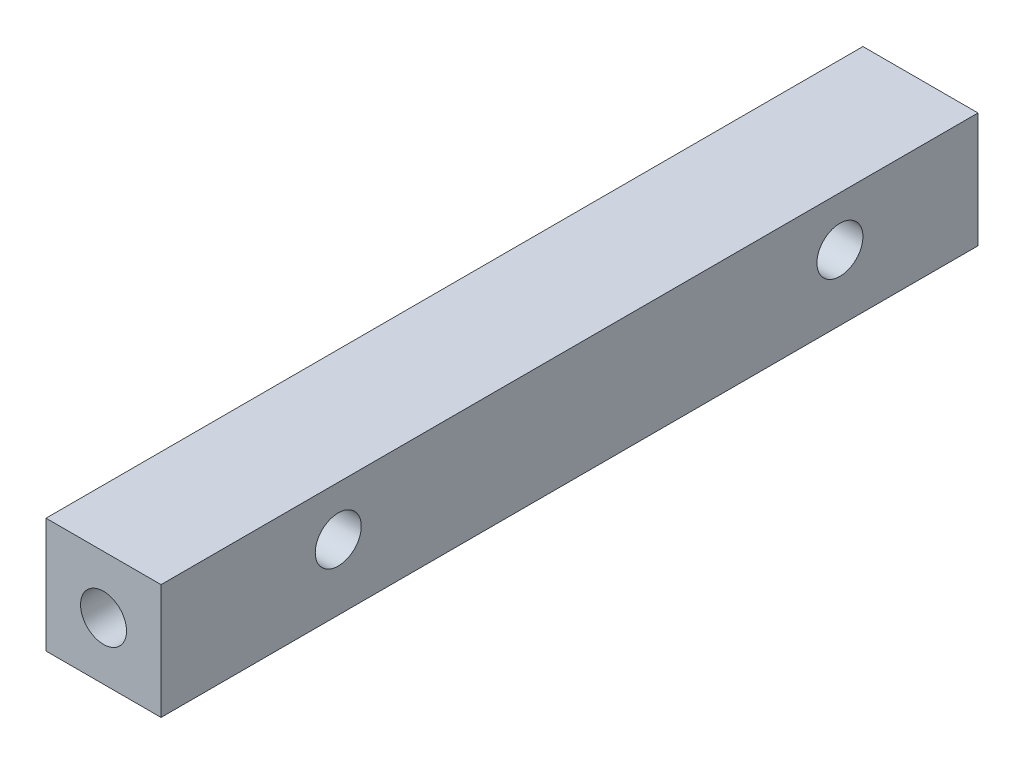
ISO-10303-21;
HEADER;
FILE_DESCRIPTION(('STEP AP214'),'2;1');
FILE_NAME('part.step','',(''),(''),'','','');
FILE_SCHEMA(('AUTOMOTIVE_DESIGN { 1 0 10303 214 1 1 1 1 }'));
ENDSEC;
DATA;
#1=APPLICATION_CONTEXT('core data for automotive mechanical design processes');
#2=APPLICATION_PROTOCOL_DEFINITION('international standard','automotive_design',2000,#1);
#3=PRODUCT_CONTEXT('',#1,'mechanical');
#4=PRODUCT('Part','Part','',(#3));
#5=PRODUCT_RELATED_PRODUCT_CATEGORY('part','',(#4));
#6=PRODUCT_DEFINITION_FORMATION('','',#4);
#7=PRODUCT_DEFINITION_CONTEXT('part definition',#1,'design');
#8=PRODUCT_DEFINITION('design','',#6,#7);
#9=PRODUCT_DEFINITION_SHAPE('','',#8);
#10=(LENGTH_UNIT() NAMED_UNIT(*) SI_UNIT(.MILLI.,.METRE.));
#11=(NAMED_UNIT(*) PLANE_ANGLE_UNIT() SI_UNIT($,.RADIAN.));
#12=(NAMED_UNIT(*) SI_UNIT($,.STERADIAN.) SOLID_ANGLE_UNIT());
#13=UNCERTAINTY_MEASURE_WITH_UNIT(LENGTH_MEASURE(1.E-05),#10,'distance_accuracy_value','');
#14=(GEOMETRIC_REPRESENTATION_CONTEXT(3) GLOBAL_UNCERTAINTY_ASSIGNED_CONTEXT((#13)) GLOBAL_UNIT_ASSIGNED_CONTEXT((#10,
#11,#12)) REPRESENTATION_CONTEXT('',''));
#15=CARTESIAN_POINT('',(0.,0.,0.));
#16=DIRECTION('',(0.,0.,1.));
#17=DIRECTION('',(1.,0.,0.));
#18=AXIS2_PLACEMENT_3D('',#15,#16,#17);
#19=CARTESIAN_POINT('',(0.,0.,71.));
#20=DIRECTION('',(1.,0.,0.));
#21=DIRECTION('',(0.,0.,-1.));
#22=AXIS2_PLACEMENT_3D('',#19,#20,#21);
#23=PLANE('',#22);
#24=CARTESIAN_POINT('',(0.,5.7,55.6));
#25=DIRECTION('',(-1.,0.,0.));
#26=DIRECTION('',(0.,0.,1.));
#27=AXIS2_PLACEMENT_3D('',#24,#25,#26);
#28=CIRCLE('',#27,2.);
#29=CARTESIAN_POINT('',(0.,5.7,57.6));
#30=VERTEX_POINT('',#29);
#31=EDGE_CURVE('E116',#30,#30,#28,.T.);
#32=ORIENTED_EDGE('',*,*,#31,.F.);
#33=EDGE_LOOP('',(#32));
#34=FACE_BOUND('',#33,.T.);
#35=CARTESIAN_POINT('',(0.,5.69999999999999,12.));
#36=DIRECTION('',(-1.,0.,0.));
#37=DIRECTION('',(0.,0.,1.));
#38=AXIS2_PLACEMENT_3D('',#35,#36,#37);
#39=CIRCLE('',#38,2.);
#40=CARTESIAN_POINT('',(0.,5.69999999999999,14.));
#41=VERTEX_POINT('',#40);
#42=EDGE_CURVE('E110',#41,#41,#39,.T.);
#43=ORIENTED_EDGE('',*,*,#42,.F.);
#44=EDGE_LOOP('',(#43));
#45=FACE_BOUND('',#44,.T.);
#46=DIRECTION('',(0.,-1.,0.));
#47=VECTOR('',#46,1.);
#48=CARTESIAN_POINT('',(0.,0.,0.));
#49=LINE('',#48,#47);
#50=CARTESIAN_POINT('',(0.,10.,0.));
#51=VERTEX_POINT('',#50);
#52=CARTESIAN_POINT('',(0.,0.,0.));
#53=VERTEX_POINT('',#52);
#54=EDGE_CURVE('E96',#51,#53,#49,.T.);
#55=ORIENTED_EDGE('',*,*,#54,.T.);
#56=DIRECTION('',(0.,0.,-1.));
#57=VECTOR('',#56,1.);
#58=CARTESIAN_POINT('',(0.,0.,71.));
#59=LINE('',#58,#57);
#60=CARTESIAN_POINT('',(0.,0.,71.));
#61=VERTEX_POINT('',#60);
#62=EDGE_CURVE('E11',#61,#53,#59,.T.);
#63=ORIENTED_EDGE('',*,*,#62,.F.);
#64=DIRECTION('',(0.,-1.,0.));
#65=VECTOR('',#64,1.);
#66=CARTESIAN_POINT('',(0.,0.,71.));
#67=LINE('',#66,#65);
#68=CARTESIAN_POINT('',(0.,10.,71.));
#69=VERTEX_POINT('',#68);
#70=EDGE_CURVE('E84',#69,#61,#67,.T.);
#71=ORIENTED_EDGE('',*,*,#70,.F.);
#72=DIRECTION('',(0.,0.,-1.));
#73=VECTOR('',#72,1.);
#74=CARTESIAN_POINT('',(0.,10.,71.));
#75=LINE('',#74,#73);
#76=EDGE_CURVE('E92',#69,#51,#75,.T.);
#77=ORIENTED_EDGE('',*,*,#76,.T.);
#78=EDGE_LOOP('',(#55,#63,#71,#77));
#79=FACE_BOUND('',#78,.T.);
#80=ADVANCED_FACE('F33',(#34,#45,#79),#23,.F.);
#81=CARTESIAN_POINT('',(0.,0.,71.));
#82=DIRECTION('',(0.,1.,0.));
#83=DIRECTION('',(0.,0.,1.));
#84=AXIS2_PLACEMENT_3D('',#81,#82,#83);
#85=PLANE('',#84);
#86=DIRECTION('',(1.,0.,0.));
#87=VECTOR('',#86,1.);
#88=CARTESIAN_POINT('',(0.,0.,0.));
#89=LINE('',#88,#87);
#90=CARTESIAN_POINT('',(10.,0.,0.));
#91=VERTEX_POINT('',#90);
#92=EDGE_CURVE('E88',#53,#91,#89,.T.);
#93=ORIENTED_EDGE('',*,*,#92,.T.);
#94=DIRECTION('',(0.,0.,-1.));
#95=VECTOR('',#94,1.);
#96=CARTESIAN_POINT('',(10.,0.,71.));
#97=LINE('',#96,#95);
#98=CARTESIAN_POINT('',(10.,0.,71.));
#99=VERTEX_POINT('',#98);
#100=EDGE_CURVE('E41',#99,#91,#97,.T.);
#101=ORIENTED_EDGE('',*,*,#100,.F.);
#102=DIRECTION('',(1.,0.,0.));
#103=VECTOR('',#102,1.);
#104=CARTESIAN_POINT('',(0.,0.,71.));
#105=LINE('',#104,#103);
#106=EDGE_CURVE('E79',#61,#99,#105,.T.);
#107=ORIENTED_EDGE('',*,*,#106,.F.);
#108=ORIENTED_EDGE('',*,*,#62,.T.);
#109=EDGE_LOOP('',(#93,#101,#107,#108));
#110=FACE_BOUND('',#109,.T.);
#111=ADVANCED_FACE('F87',(#110),#85,.F.);
#112=CARTESIAN_POINT('',(10.,0.,71.));
#113=DIRECTION('',(-1.,0.,0.));
#114=DIRECTION('',(0.,0.,1.));
#115=AXIS2_PLACEMENT_3D('',#112,#113,#114);
#116=PLANE('',#115);
#117=CARTESIAN_POINT('',(10.,5.7,55.6));
#118=DIRECTION('',(-1.,0.,0.));
#119=DIRECTION('',(0.,0.,1.));
#120=AXIS2_PLACEMENT_3D('',#117,#118,#119);
#121=CIRCLE('',#120,2.);
#122=CARTESIAN_POINT('',(10.,5.7,57.6));
#123=VERTEX_POINT('',#122);
#124=EDGE_CURVE('E113',#123,#123,#121,.T.);
#125=ORIENTED_EDGE('',*,*,#124,.T.);
#126=EDGE_LOOP('',(#125));
#127=FACE_BOUND('',#126,.T.);
#128=CARTESIAN_POINT('',(10.,5.69999999999999,12.));
#129=DIRECTION('',(-1.,0.,0.));
#130=DIRECTION('',(0.,0.,1.));
#131=AXIS2_PLACEMENT_3D('',#128,#129,#130);
#132=CIRCLE('',#131,2.);
#133=CARTESIAN_POINT('',(10.,5.69999999999999,14.));
#134=VERTEX_POINT('',#133);
#135=EDGE_CURVE('E99',#134,#134,#132,.T.);
#136=ORIENTED_EDGE('',*,*,#135,.T.);
#137=EDGE_LOOP('',(#136));
#138=FACE_BOUND('',#137,.T.);
#139=DIRECTION('',(0.,1.,0.));
#140=VECTOR('',#139,1.);
#141=CARTESIAN_POINT('',(10.,0.,0.));
#142=LINE('',#141,#140);
#143=CARTESIAN_POINT('',(10.,10.,0.));
#144=VERTEX_POINT('',#143);
#145=EDGE_CURVE('E66',#91,#144,#142,.T.);
#146=ORIENTED_EDGE('',*,*,#145,.T.);
#147=DIRECTION('',(0.,0.,-1.));
#148=VECTOR('',#147,1.);
#149=CARTESIAN_POINT('',(10.,10.,71.));
#150=LINE('',#149,#148);
#151=CARTESIAN_POINT('',(10.,10.,71.));
#152=VERTEX_POINT('',#151);
#153=EDGE_CURVE('E89',#152,#144,#150,.T.);
#154=ORIENTED_EDGE('',*,*,#153,.F.);
#155=DIRECTION('',(0.,1.,0.));
#156=VECTOR('',#155,1.);
#157=CARTESIAN_POINT('',(10.,0.,71.));
#158=LINE('',#157,#156);
#159=EDGE_CURVE('E82',#99,#152,#158,.T.);
#160=ORIENTED_EDGE('',*,*,#159,.F.);
#161=ORIENTED_EDGE('',*,*,#100,.T.);
#162=EDGE_LOOP('',(#146,#154,#160,#161));
#163=FACE_BOUND('',#162,.T.);
#164=ADVANCED_FACE('F90',(#127,#138,#163),#116,.F.);
#165=CARTESIAN_POINT('',(0.,10.,71.));
#166=DIRECTION('',(0.,-1.,0.));
#167=DIRECTION('',(0.,0.,-1.));
#168=AXIS2_PLACEMENT_3D('',#165,#166,#167);
#169=PLANE('',#168);
#170=DIRECTION('',(-1.,0.,0.));
#171=VECTOR('',#170,1.);
#172=CARTESIAN_POINT('',(0.,10.,0.));
#173=LINE('',#172,#171);
#174=EDGE_CURVE('E72',#144,#51,#173,.T.);
#175=ORIENTED_EDGE('',*,*,#174,.T.);
#176=ORIENTED_EDGE('',*,*,#76,.F.);
#177=DIRECTION('',(-1.,0.,0.));
#178=VECTOR('',#177,1.);
#179=CARTESIAN_POINT('',(0.,10.,71.));
#180=LINE('',#179,#178);
#181=EDGE_CURVE('E49',#152,#69,#180,.T.);
#182=ORIENTED_EDGE('',*,*,#181,.F.);
#183=ORIENTED_EDGE('',*,*,#153,.T.);
#184=EDGE_LOOP('',(#175,#176,#182,#183));
#185=FACE_BOUND('',#184,.T.);
#186=ADVANCED_FACE('F104',(#185),#169,.F.);
#187=CARTESIAN_POINT('',(0.,0.,71.));
#188=DIRECTION('',(0.,0.,-1.));
#189=DIRECTION('',(-1.,0.,0.));
#190=AXIS2_PLACEMENT_3D('',#187,#188,#189);
#191=PLANE('',#190);
#192=CARTESIAN_POINT('',(5.,5.,71.));
#193=DIRECTION('',(0.,0.,1.));
#194=DIRECTION('',(1.,0.,0.));
#195=AXIS2_PLACEMENT_3D('',#192,#193,#194);
#196=CIRCLE('',#195,2.);
#197=CARTESIAN_POINT('',(7.,5.,71.));
#198=VERTEX_POINT('',#197);
#199=EDGE_CURVE('E128',#198,#198,#196,.T.);
#200=ORIENTED_EDGE('',*,*,#199,.F.);
#201=EDGE_LOOP('',(#200));
#202=FACE_BOUND('',#201,.T.);
#203=ORIENTED_EDGE('',*,*,#70,.T.);
#204=ORIENTED_EDGE('',*,*,#106,.T.);
#205=ORIENTED_EDGE('',*,*,#159,.T.);
#206=ORIENTED_EDGE('',*,*,#181,.T.);
#207=EDGE_LOOP('',(#203,#204,#205,#206));
#208=FACE_BOUND('',#207,.T.);
#209=ADVANCED_FACE('F80',(#202,#208),#191,.F.);
#210=CARTESIAN_POINT('',(0.,0.,0.));
#211=DIRECTION('',(0.,0.,-1.));
#212=DIRECTION('',(-1.,0.,0.));
#213=AXIS2_PLACEMENT_3D('',#210,#211,#212);
#214=PLANE('',#213);
#215=CARTESIAN_POINT('',(5.,5.,0.));
#216=DIRECTION('',(0.,0.,-1.));
#217=DIRECTION('',(-1.,0.,0.));
#218=AXIS2_PLACEMENT_3D('',#215,#216,#217);
#219=CIRCLE('',#218,2.);
#220=CARTESIAN_POINT('',(3.,5.,0.));
#221=VERTEX_POINT('',#220);
#222=EDGE_CURVE('E122',#221,#221,#219,.T.);
#223=ORIENTED_EDGE('',*,*,#222,.F.);
#224=EDGE_LOOP('',(#223));
#225=FACE_BOUND('',#224,.T.);
#226=ORIENTED_EDGE('',*,*,#54,.F.);
#227=ORIENTED_EDGE('',*,*,#174,.F.);
#228=ORIENTED_EDGE('',*,*,#145,.F.);
#229=ORIENTED_EDGE('',*,*,#92,.F.);
#230=EDGE_LOOP('',(#226,#227,#228,#229));
#231=FACE_BOUND('',#230,.T.);
#232=ADVANCED_FACE('F107',(#225,#231),#214,.T.);
#233=CARTESIAN_POINT('',(10.,5.69999999999999,12.));
#234=DIRECTION('',(-1.,0.,0.));
#235=DIRECTION('',(0.,0.,1.));
#236=AXIS2_PLACEMENT_3D('',#233,#234,#235);
#237=CYLINDRICAL_SURFACE('',#236,2.);
#238=ORIENTED_EDGE('',*,*,#135,.F.);
#239=EDGE_LOOP('',(#238));
#240=FACE_BOUND('',#239,.T.);
#241=ORIENTED_EDGE('',*,*,#42,.T.);
#242=EDGE_LOOP('',(#241));
#243=FACE_BOUND('',#242,.T.);
#244=ADVANCED_FACE('F149',(#240,#243),#237,.F.);
#245=CARTESIAN_POINT('',(10.,5.7,55.6));
#246=DIRECTION('',(-1.,0.,0.));
#247=DIRECTION('',(0.,0.,1.));
#248=AXIS2_PLACEMENT_3D('',#245,#246,#247);
#249=CYLINDRICAL_SURFACE('',#248,2.);
#250=ORIENTED_EDGE('',*,*,#124,.F.);
#251=EDGE_LOOP('',(#250));
#252=FACE_BOUND('',#251,.T.);
#253=ORIENTED_EDGE('',*,*,#31,.T.);
#254=EDGE_LOOP('',(#253));
#255=FACE_BOUND('',#254,.T.);
#256=ADVANCED_FACE('F164',(#252,#255),#249,.F.);
#257=CARTESIAN_POINT('',(5.,5.,6.));
#258=DIRECTION('',(0.,0.,-1.));
#259=DIRECTION('',(-1.,0.,0.));
#260=AXIS2_PLACEMENT_3D('',#257,#258,#259);
#261=CYLINDRICAL_SURFACE('',#260,2.);
#262=CARTESIAN_POINT('',(5.,5.,6.));
#263=DIRECTION('',(0.,0.,-1.));
#264=DIRECTION('',(-1.,0.,0.));
#265=AXIS2_PLACEMENT_3D('',#262,#263,#264);
#266=CIRCLE('',#265,2.);
#267=CARTESIAN_POINT('',(3.,5.,6.));
#268=VERTEX_POINT('',#267);
#269=EDGE_CURVE('E119',#268,#268,#266,.T.);
#270=ORIENTED_EDGE('',*,*,#269,.F.);
#271=EDGE_LOOP('',(#270));
#272=FACE_BOUND('',#271,.T.);
#273=ORIENTED_EDGE('',*,*,#222,.T.);
#274=EDGE_LOOP('',(#273));
#275=FACE_BOUND('',#274,.T.);
#276=ADVANCED_FACE('F169',(#272,#275),#261,.F.);
#277=CARTESIAN_POINT('',(5.,5.,6.));
#278=DIRECTION('',(0.,0.,-1.));
#279=DIRECTION('',(-1.,0.,0.));
#280=AXIS2_PLACEMENT_3D('',#277,#278,#279);
#281=PLANE('',#280);
#282=ORIENTED_EDGE('',*,*,#269,.T.);
#283=EDGE_LOOP('',(#282));
#284=FACE_BOUND('',#283,.T.);
#285=ADVANCED_FACE('F139',(#284),#281,.T.);
#286=CARTESIAN_POINT('',(5.,5.,65.));
#287=DIRECTION('',(0.,0.,1.));
#288=DIRECTION('',(1.,0.,0.));
#289=AXIS2_PLACEMENT_3D('',#286,#287,#288);
#290=CYLINDRICAL_SURFACE('',#289,2.);
#291=CARTESIAN_POINT('',(5.,5.,65.));
#292=DIRECTION('',(0.,0.,1.));
#293=DIRECTION('',(1.,0.,0.));
#294=AXIS2_PLACEMENT_3D('',#291,#292,#293);
#295=CIRCLE('',#294,2.);
#296=CARTESIAN_POINT('',(7.,5.,65.));
#297=VERTEX_POINT('',#296);
#298=EDGE_CURVE('E125',#297,#297,#295,.T.);
#299=ORIENTED_EDGE('',*,*,#298,.F.);
#300=EDGE_LOOP('',(#299));
#301=FACE_BOUND('',#300,.T.);
#302=ORIENTED_EDGE('',*,*,#199,.T.);
#303=EDGE_LOOP('',(#302));
#304=FACE_BOUND('',#303,.T.);
#305=ADVANCED_FACE('F136',(#301,#304),#290,.F.);
#306=CARTESIAN_POINT('',(5.,5.,65.));
#307=DIRECTION('',(0.,0.,1.));
#308=DIRECTION('',(1.,0.,0.));
#309=AXIS2_PLACEMENT_3D('',#306,#307,#308);
#310=PLANE('',#309);
#311=ORIENTED_EDGE('',*,*,#298,.T.);
#312=EDGE_LOOP('',(#311));
#313=FACE_BOUND('',#312,.T.);
#314=ADVANCED_FACE('F134',(#313),#310,.T.);
#315=CLOSED_SHELL('',(#80,#111,#164,#186,#209,#232,#244,#256,#276,#285,#305,#314));
#316=MANIFOLD_SOLID_BREP('B2',#315);
#317=ADVANCED_BREP_SHAPE_REPRESENTATION('',(#18,#316),#14);
#318=SHAPE_DEFINITION_REPRESENTATION(#9,#317);
ENDSEC;
END-ISO-10303-21;
